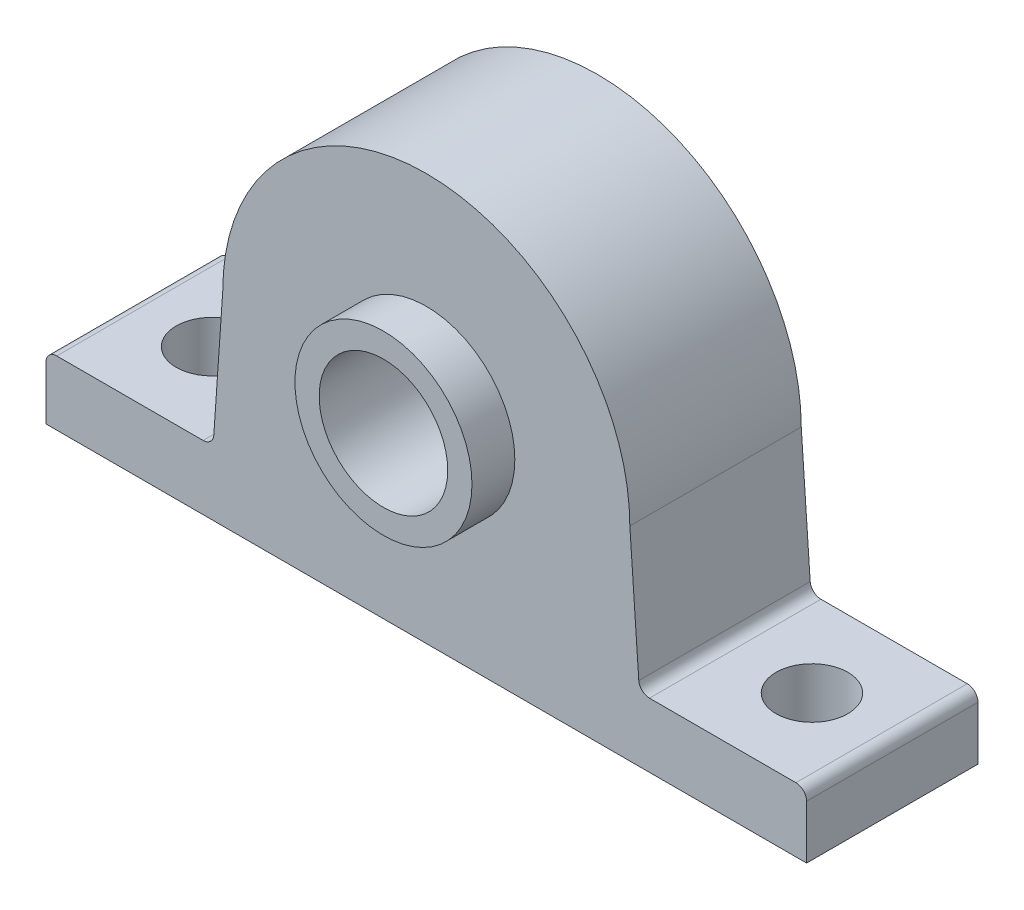
ISO-10303-21;
HEADER;
FILE_DESCRIPTION(('STEP AP214'),'2;1');
FILE_NAME('part.step','',(''),(''),'','','');
FILE_SCHEMA(('AUTOMOTIVE_DESIGN { 1 0 10303 214 1 1 1 1 }'));
ENDSEC;
DATA;
#1=APPLICATION_CONTEXT('core data for automotive mechanical design processes');
#2=APPLICATION_PROTOCOL_DEFINITION('international standard','automotive_design',2000,#1);
#3=PRODUCT_CONTEXT('',#1,'mechanical');
#4=PRODUCT('Part','Part','',(#3));
#5=PRODUCT_RELATED_PRODUCT_CATEGORY('part','',(#4));
#6=PRODUCT_DEFINITION_FORMATION('','',#4);
#7=PRODUCT_DEFINITION_CONTEXT('part definition',#1,'design');
#8=PRODUCT_DEFINITION('design','',#6,#7);
#9=PRODUCT_DEFINITION_SHAPE('','',#8);
#10=(LENGTH_UNIT() NAMED_UNIT(*) SI_UNIT(.MILLI.,.METRE.));
#11=(NAMED_UNIT(*) PLANE_ANGLE_UNIT() SI_UNIT($,.RADIAN.));
#12=(NAMED_UNIT(*) SI_UNIT($,.STERADIAN.) SOLID_ANGLE_UNIT());
#13=UNCERTAINTY_MEASURE_WITH_UNIT(LENGTH_MEASURE(1.E-05),#10,'distance_accuracy_value','');
#14=(GEOMETRIC_REPRESENTATION_CONTEXT(3) GLOBAL_UNCERTAINTY_ASSIGNED_CONTEXT((#13)) GLOBAL_UNIT_ASSIGNED_CONTEXT((#10,
#11,#12)) REPRESENTATION_CONTEXT('',''));
#15=CARTESIAN_POINT('',(0.,0.,0.));
#16=DIRECTION('',(0.,0.,1.));
#17=DIRECTION('',(1.,0.,0.));
#18=AXIS2_PLACEMENT_3D('',#15,#16,#17);
#19=CARTESIAN_POINT('',(0.,0.,16.));
#20=DIRECTION('',(0.,0.,1.));
#21=DIRECTION('',(1.,0.,0.));
#22=AXIS2_PLACEMENT_3D('',#19,#20,#21);
#23=PLANE('',#22);
#24=DIRECTION('',(1.,0.,0.));
#25=VECTOR('',#24,1.);
#26=CARTESIAN_POINT('',(0.,-13.,16.));
#27=LINE('',#26,#25);
#28=CARTESIAN_POINT('',(-34.5,-13.,16.));
#29=VERTEX_POINT('',#28);
#30=CARTESIAN_POINT('',(-20.8331628158486,-13.,16.));
#31=VERTEX_POINT('',#30);
#32=EDGE_CURVE('E204',#29,#31,#27,.T.);
#33=ORIENTED_EDGE('',*,*,#32,.F.);
#34=CARTESIAN_POINT('',(-34.5,-14.,16.));
#35=DIRECTION('',(0.,0.,1.));
#36=DIRECTION('',(1.,0.,0.));
#37=AXIS2_PLACEMENT_3D('',#34,#35,#36);
#38=CIRCLE('',#37,1.);
#39=CARTESIAN_POINT('',(-35.5,-14.,16.));
#40=VERTEX_POINT('',#39);
#41=EDGE_CURVE('E171',#29,#40,#38,.T.);
#42=ORIENTED_EDGE('',*,*,#41,.T.);
#43=DIRECTION('',(0.,1.,0.));
#44=VECTOR('',#43,1.);
#45=CARTESIAN_POINT('',(-35.5,0.,16.));
#46=LINE('',#45,#44);
#47=CARTESIAN_POINT('',(-35.5,-19.,16.));
#48=VERTEX_POINT('',#47);
#49=EDGE_CURVE('E143',#48,#40,#46,.T.);
#50=ORIENTED_EDGE('',*,*,#49,.F.);
#51=DIRECTION('',(1.,0.,0.));
#52=VECTOR('',#51,1.);
#53=CARTESIAN_POINT('',(0.,-19.,16.));
#54=LINE('',#53,#52);
#55=CARTESIAN_POINT('',(35.5,-19.,16.));
#56=VERTEX_POINT('',#55);
#57=EDGE_CURVE('E136',#48,#56,#54,.T.);
#58=ORIENTED_EDGE('',*,*,#57,.T.);
#59=DIRECTION('',(0.,1.,0.));
#60=VECTOR('',#59,1.);
#61=CARTESIAN_POINT('',(35.5,0.,16.));
#62=LINE('',#61,#60);
#63=CARTESIAN_POINT('',(35.5,-14.,16.));
#64=VERTEX_POINT('',#63);
#65=EDGE_CURVE('E125',#56,#64,#62,.T.);
#66=ORIENTED_EDGE('',*,*,#65,.T.);
#67=CARTESIAN_POINT('',(34.5,-14.,16.));
#68=DIRECTION('',(0.,0.,1.));
#69=DIRECTION('',(1.,0.,0.));
#70=AXIS2_PLACEMENT_3D('',#67,#68,#69);
#71=CIRCLE('',#70,1.);
#72=CARTESIAN_POINT('',(34.5,-13.,16.));
#73=VERTEX_POINT('',#72);
#74=EDGE_CURVE('E169',#64,#73,#71,.T.);
#75=ORIENTED_EDGE('',*,*,#74,.T.);
#76=DIRECTION('',(-1.,0.,0.));
#77=VECTOR('',#76,1.);
#78=CARTESIAN_POINT('',(0.,-13.,16.));
#79=LINE('',#78,#77);
#80=CARTESIAN_POINT('',(20.8331628158486,-13.,16.));
#81=VERTEX_POINT('',#80);
#82=EDGE_CURVE('E135',#73,#81,#79,.T.);
#83=ORIENTED_EDGE('',*,*,#82,.T.);
#84=CARTESIAN_POINT('',(20.8331628158486,-12.,16.));
#85=DIRECTION('',(0.,0.,1.));
#86=DIRECTION('',(1.,0.,0.));
#87=AXIS2_PLACEMENT_3D('',#84,#85,#86);
#88=CIRCLE('',#87,1.);
#89=CARTESIAN_POINT('',(19.8355506853592,-12.0690654551877,16.));
#90=VERTEX_POINT('',#89);
#91=EDGE_CURVE('E58',#81,#90,#88,.F.);
#92=ORIENTED_EDGE('',*,*,#91,.T.);
#93=DIRECTION('',(-0.0690654551877314,0.997612130489456,0.));
#94=VECTOR('',#93,1.);
#95=CARTESIAN_POINT('',(18.9093692950945,1.30911018196808,16.));
#96=LINE('',#95,#94);
#97=CARTESIAN_POINT('',(19.,0.,16.));
#98=VERTEX_POINT('',#97);
#99=EDGE_CURVE('E414',#90,#98,#96,.T.);
#100=ORIENTED_EDGE('',*,*,#99,.T.);
#101=CARTESIAN_POINT('',(0.,0.,16.));
#102=DIRECTION('',(0.,0.,1.));
#103=DIRECTION('',(1.,0.,0.));
#104=AXIS2_PLACEMENT_3D('',#101,#102,#103);
#105=CIRCLE('',#104,19.);
#106=CARTESIAN_POINT('',(-19.,0.,16.));
#107=VERTEX_POINT('',#106);
#108=EDGE_CURVE('E214',#98,#107,#105,.T.);
#109=ORIENTED_EDGE('',*,*,#108,.T.);
#110=DIRECTION('',(0.0690654551877314,0.997612130489456,0.));
#111=VECTOR('',#110,1.);
#112=CARTESIAN_POINT('',(-18.9093692950945,1.30911018196808,16.));
#113=LINE('',#112,#111);
#114=CARTESIAN_POINT('',(-19.8355506853592,-12.0690654551877,16.));
#115=VERTEX_POINT('',#114);
#116=EDGE_CURVE('E207',#115,#107,#113,.T.);
#117=ORIENTED_EDGE('',*,*,#116,.F.);
#118=CARTESIAN_POINT('',(-20.8331628158486,-12.,16.));
#119=DIRECTION('',(0.,0.,1.));
#120=DIRECTION('',(1.,0.,0.));
#121=AXIS2_PLACEMENT_3D('',#118,#119,#120);
#122=CIRCLE('',#121,1.);
#123=EDGE_CURVE('E11',#115,#31,#122,.F.);
#124=ORIENTED_EDGE('',*,*,#123,.T.);
#125=EDGE_LOOP('',(#33,#42,#50,#58,#66,#75,#83,#92,#100,#109,#117,#124));
#126=FACE_BOUND('',#125,.T.);
#127=CARTESIAN_POINT('',(0.,0.,16.));
#128=DIRECTION('',(0.,0.,1.));
#129=DIRECTION('',(1.,0.,0.));
#130=AXIS2_PLACEMENT_3D('',#127,#128,#129);
#131=CIRCLE('',#130,8.265);
#132=CARTESIAN_POINT('',(8.265,0.,16.));
#133=VERTEX_POINT('',#132);
#134=EDGE_CURVE('E420',#133,#133,#131,.T.);
#135=ORIENTED_EDGE('',*,*,#134,.F.);
#136=EDGE_LOOP('',(#135));
#137=FACE_BOUND('',#136,.T.);
#138=ADVANCED_FACE('F35',(#126,#137),#23,.T.);
#139=CARTESIAN_POINT('',(0.,-19.,16.));
#140=DIRECTION('',(0.,1.,0.));
#141=DIRECTION('',(0.,0.,1.));
#142=AXIS2_PLACEMENT_3D('',#139,#140,#141);
#143=PLANE('',#142);
#144=CARTESIAN_POINT('',(-28.,-19.,8.));
#145=DIRECTION('',(0.,-1.,0.));
#146=DIRECTION('',(0.,0.,1.));
#147=AXIS2_PLACEMENT_3D('',#144,#145,#146);
#148=CIRCLE('',#147,3.35);
#149=CARTESIAN_POINT('',(-28.,-19.,11.35));
#150=VERTEX_POINT('',#149);
#151=EDGE_CURVE('E434',#150,#150,#148,.T.);
#152=ORIENTED_EDGE('',*,*,#151,.F.);
#153=EDGE_LOOP('',(#152));
#154=FACE_BOUND('',#153,.T.);
#155=CARTESIAN_POINT('',(28.,-19.,8.));
#156=DIRECTION('',(0.,-1.,0.));
#157=DIRECTION('',(0.,0.,-1.));
#158=AXIS2_PLACEMENT_3D('',#155,#156,#157);
#159=CIRCLE('',#158,3.35);
#160=CARTESIAN_POINT('',(28.,-19.,4.65));
#161=VERTEX_POINT('',#160);
#162=EDGE_CURVE('E431',#161,#161,#159,.T.);
#163=ORIENTED_EDGE('',*,*,#162,.F.);
#164=EDGE_LOOP('',(#163));
#165=FACE_BOUND('',#164,.T.);
#166=DIRECTION('',(1.,0.,0.));
#167=VECTOR('',#166,1.);
#168=CARTESIAN_POINT('',(0.,-19.,0.));
#169=LINE('',#168,#167);
#170=CARTESIAN_POINT('',(-35.5,-19.,0.));
#171=VERTEX_POINT('',#170);
#172=CARTESIAN_POINT('',(35.5,-19.,0.));
#173=VERTEX_POINT('',#172);
#174=EDGE_CURVE('E149',#171,#173,#169,.T.);
#175=ORIENTED_EDGE('',*,*,#174,.T.);
#176=DIRECTION('',(0.,0.,-1.));
#177=VECTOR('',#176,1.);
#178=CARTESIAN_POINT('',(35.5,-19.,16.));
#179=LINE('',#178,#177);
#180=EDGE_CURVE('E130',#56,#173,#179,.T.);
#181=ORIENTED_EDGE('',*,*,#180,.F.);
#182=ORIENTED_EDGE('',*,*,#57,.F.);
#183=DIRECTION('',(0.,0.,-1.));
#184=VECTOR('',#183,1.);
#185=CARTESIAN_POINT('',(-35.5,-19.,16.));
#186=LINE('',#185,#184);
#187=EDGE_CURVE('E212',#48,#171,#186,.T.);
#188=ORIENTED_EDGE('',*,*,#187,.T.);
#189=EDGE_LOOP('',(#175,#181,#182,#188));
#190=FACE_BOUND('',#189,.T.);
#191=ADVANCED_FACE('F147',(#154,#165,#190),#143,.F.);
#192=CARTESIAN_POINT('',(35.5,0.,16.));
#193=DIRECTION('',(-1.,0.,0.));
#194=DIRECTION('',(0.,0.,1.));
#195=AXIS2_PLACEMENT_3D('',#192,#193,#194);
#196=PLANE('',#195);
#197=DIRECTION('',(0.,1.,0.));
#198=VECTOR('',#197,1.);
#199=CARTESIAN_POINT('',(35.5,0.,0.));
#200=LINE('',#199,#198);
#201=CARTESIAN_POINT('',(35.5,-14.,0.));
#202=VERTEX_POINT('',#201);
#203=EDGE_CURVE('E219',#173,#202,#200,.T.);
#204=ORIENTED_EDGE('',*,*,#203,.T.);
#205=DIRECTION('',(0.,0.,-1.));
#206=VECTOR('',#205,1.);
#207=CARTESIAN_POINT('',(35.5,-14.,16.));
#208=LINE('',#207,#206);
#209=EDGE_CURVE('E133',#202,#64,#208,.F.);
#210=ORIENTED_EDGE('',*,*,#209,.T.);
#211=ORIENTED_EDGE('',*,*,#65,.F.);
#212=ORIENTED_EDGE('',*,*,#180,.T.);
#213=EDGE_LOOP('',(#204,#210,#211,#212));
#214=FACE_BOUND('',#213,.T.);
#215=ADVANCED_FACE('F128',(#214),#196,.F.);
#216=CARTESIAN_POINT('',(0.,-13.,16.));
#217=DIRECTION('',(0.,-1.,0.));
#218=DIRECTION('',(0.,0.,-1.));
#219=AXIS2_PLACEMENT_3D('',#216,#217,#218);
#220=PLANE('',#219);
#221=CARTESIAN_POINT('',(28.,-13.,8.));
#222=DIRECTION('',(0.,-1.,0.));
#223=DIRECTION('',(0.,0.,-1.));
#224=AXIS2_PLACEMENT_3D('',#221,#222,#223);
#225=CIRCLE('',#224,3.35);
#226=CARTESIAN_POINT('',(28.,-13.,4.65));
#227=VERTEX_POINT('',#226);
#228=EDGE_CURVE('E428',#227,#227,#225,.F.);
#229=ORIENTED_EDGE('',*,*,#228,.F.);
#230=EDGE_LOOP('',(#229));
#231=FACE_BOUND('',#230,.T.);
#232=ORIENTED_EDGE('',*,*,#82,.F.);
#233=DIRECTION('',(0.,0.,-1.));
#234=VECTOR('',#233,1.);
#235=CARTESIAN_POINT('',(34.5,-13.,16.));
#236=LINE('',#235,#234);
#237=CARTESIAN_POINT('',(34.5,-13.,0.));
#238=VERTEX_POINT('',#237);
#239=EDGE_CURVE('E175',#73,#238,#236,.T.);
#240=ORIENTED_EDGE('',*,*,#239,.T.);
#241=DIRECTION('',(-1.,0.,0.));
#242=VECTOR('',#241,1.);
#243=CARTESIAN_POINT('',(0.,-13.,0.));
#244=LINE('',#243,#242);
#245=CARTESIAN_POINT('',(20.8331628158486,-13.,0.));
#246=VERTEX_POINT('',#245);
#247=EDGE_CURVE('E222',#238,#246,#244,.T.);
#248=ORIENTED_EDGE('',*,*,#247,.T.);
#249=DIRECTION('',(0.,0.,-1.));
#250=VECTOR('',#249,1.);
#251=CARTESIAN_POINT('',(20.8331628158486,-13.,16.));
#252=LINE('',#251,#250);
#253=EDGE_CURVE('E173',#246,#81,#252,.F.);
#254=ORIENTED_EDGE('',*,*,#253,.T.);
#255=EDGE_LOOP('',(#232,#240,#248,#254));
#256=FACE_BOUND('',#255,.T.);
#257=ADVANCED_FACE('F282',(#231,#256),#220,.F.);
#258=CARTESIAN_POINT('',(18.9093692950945,1.30911018196808,16.));
#259=DIRECTION('',(-0.997612130489456,-0.0690654551877314,0.));
#260=DIRECTION('',(0.0690654551877314,-0.997612130489456,0.));
#261=AXIS2_PLACEMENT_3D('',#258,#259,#260);
#262=PLANE('',#261);
#263=ORIENTED_EDGE('',*,*,#99,.F.);
#264=DIRECTION('',(0.,0.,-1.));
#265=VECTOR('',#264,1.);
#266=CARTESIAN_POINT('',(19.8355506853592,-12.0690654551877,0.));
#267=LINE('',#266,#265);
#268=CARTESIAN_POINT('',(19.8355506853592,-12.0690654551877,0.));
#269=VERTEX_POINT('',#268);
#270=EDGE_CURVE('E179',#90,#269,#267,.T.);
#271=ORIENTED_EDGE('',*,*,#270,.T.);
#272=DIRECTION('',(-0.0690654551877314,0.997612130489456,0.));
#273=VECTOR('',#272,1.);
#274=CARTESIAN_POINT('',(18.9093692950945,1.30911018196808,0.));
#275=LINE('',#274,#273);
#276=CARTESIAN_POINT('',(19.,0.,0.));
#277=VERTEX_POINT('',#276);
#278=EDGE_CURVE('E225',#269,#277,#275,.T.);
#279=ORIENTED_EDGE('',*,*,#278,.T.);
#280=DIRECTION('',(0.,0.,-1.));
#281=VECTOR('',#280,1.);
#282=CARTESIAN_POINT('',(19.,0.,16.));
#283=LINE('',#282,#281);
#284=EDGE_CURVE('E151',#98,#277,#283,.T.);
#285=ORIENTED_EDGE('',*,*,#284,.F.);
#286=EDGE_LOOP('',(#263,#271,#279,#285));
#287=FACE_BOUND('',#286,.T.);
#288=ADVANCED_FACE('F278',(#287),#262,.F.);
#289=CARTESIAN_POINT('',(0.,0.,16.));
#290=DIRECTION('',(0.,0.,-1.));
#291=DIRECTION('',(-1.,0.,0.));
#292=AXIS2_PLACEMENT_3D('',#289,#290,#291);
#293=CYLINDRICAL_SURFACE('',#292,19.);
#294=CARTESIAN_POINT('',(0.,0.,0.));
#295=DIRECTION('',(0.,0.,1.));
#296=DIRECTION('',(1.,0.,0.));
#297=AXIS2_PLACEMENT_3D('',#294,#295,#296);
#298=CIRCLE('',#297,19.);
#299=CARTESIAN_POINT('',(-19.,0.,0.));
#300=VERTEX_POINT('',#299);
#301=EDGE_CURVE('E200',#277,#300,#298,.T.);
#302=ORIENTED_EDGE('',*,*,#301,.T.);
#303=DIRECTION('',(0.,0.,-1.));
#304=VECTOR('',#303,1.);
#305=CARTESIAN_POINT('',(-19.,0.,16.));
#306=LINE('',#305,#304);
#307=EDGE_CURVE('E157',#107,#300,#306,.T.);
#308=ORIENTED_EDGE('',*,*,#307,.F.);
#309=ORIENTED_EDGE('',*,*,#108,.F.);
#310=ORIENTED_EDGE('',*,*,#284,.T.);
#311=EDGE_LOOP('',(#302,#308,#309,#310));
#312=FACE_BOUND('',#311,.T.);
#313=ADVANCED_FACE('F275',(#312),#293,.T.);
#314=CARTESIAN_POINT('',(-18.9093692950945,1.30911018196808,16.));
#315=DIRECTION('',(-0.997612130489456,0.0690654551877314,0.));
#316=DIRECTION('',(-0.0690654551877314,-0.997612130489456,0.));
#317=AXIS2_PLACEMENT_3D('',#314,#315,#316);
#318=PLANE('',#317);
#319=DIRECTION('',(0.0690654551877314,0.997612130489456,0.));
#320=VECTOR('',#319,1.);
#321=CARTESIAN_POINT('',(-18.9093692950945,1.30911018196808,0.));
#322=LINE('',#321,#320);
#323=CARTESIAN_POINT('',(-19.8355506853592,-12.0690654551877,0.));
#324=VERTEX_POINT('',#323);
#325=EDGE_CURVE('E191',#324,#300,#322,.T.);
#326=ORIENTED_EDGE('',*,*,#325,.F.);
#327=DIRECTION('',(0.,0.,-1.));
#328=VECTOR('',#327,1.);
#329=CARTESIAN_POINT('',(-19.8355506853592,-12.0690654551877,16.));
#330=LINE('',#329,#328);
#331=EDGE_CURVE('E50',#324,#115,#330,.F.);
#332=ORIENTED_EDGE('',*,*,#331,.T.);
#333=ORIENTED_EDGE('',*,*,#116,.T.);
#334=ORIENTED_EDGE('',*,*,#307,.T.);
#335=EDGE_LOOP('',(#326,#332,#333,#334));
#336=FACE_BOUND('',#335,.T.);
#337=ADVANCED_FACE('F197',(#336),#318,.T.);
#338=CARTESIAN_POINT('',(0.,-13.,16.));
#339=DIRECTION('',(0.,1.,0.));
#340=DIRECTION('',(0.,0.,1.));
#341=AXIS2_PLACEMENT_3D('',#338,#339,#340);
#342=PLANE('',#341);
#343=CARTESIAN_POINT('',(-28.,-13.,8.));
#344=DIRECTION('',(0.,1.,0.));
#345=DIRECTION('',(0.,0.,1.));
#346=AXIS2_PLACEMENT_3D('',#343,#344,#345);
#347=CIRCLE('',#346,3.35);
#348=CARTESIAN_POINT('',(-28.,-13.,11.35));
#349=VERTEX_POINT('',#348);
#350=EDGE_CURVE('E435',#349,#349,#347,.F.);
#351=ORIENTED_EDGE('',*,*,#350,.T.);
#352=EDGE_LOOP('',(#351));
#353=FACE_BOUND('',#352,.T.);
#354=DIRECTION('',(1.,0.,0.));
#355=VECTOR('',#354,1.);
#356=CARTESIAN_POINT('',(0.,-13.,0.));
#357=LINE('',#356,#355);
#358=CARTESIAN_POINT('',(-34.5,-13.,0.));
#359=VERTEX_POINT('',#358);
#360=CARTESIAN_POINT('',(-20.8331628158486,-13.,0.));
#361=VERTEX_POINT('',#360);
#362=EDGE_CURVE('E194',#359,#361,#357,.T.);
#363=ORIENTED_EDGE('',*,*,#362,.F.);
#364=DIRECTION('',(0.,0.,-1.));
#365=VECTOR('',#364,1.);
#366=CARTESIAN_POINT('',(-34.5,-13.,16.));
#367=LINE('',#366,#365);
#368=EDGE_CURVE('E167',#359,#29,#367,.F.);
#369=ORIENTED_EDGE('',*,*,#368,.T.);
#370=ORIENTED_EDGE('',*,*,#32,.T.);
#371=DIRECTION('',(0.,0.,-1.));
#372=VECTOR('',#371,1.);
#373=CARTESIAN_POINT('',(-20.8331628158486,-13.,0.));
#374=LINE('',#373,#372);
#375=EDGE_CURVE('E164',#31,#361,#374,.T.);
#376=ORIENTED_EDGE('',*,*,#375,.T.);
#377=EDGE_LOOP('',(#363,#369,#370,#376));
#378=FACE_BOUND('',#377,.T.);
#379=ADVANCED_FACE('F209',(#353,#378),#342,.T.);
#380=CARTESIAN_POINT('',(-35.5,0.,16.));
#381=DIRECTION('',(-1.,0.,0.));
#382=DIRECTION('',(0.,0.,1.));
#383=AXIS2_PLACEMENT_3D('',#380,#381,#382);
#384=PLANE('',#383);
#385=ORIENTED_EDGE('',*,*,#49,.T.);
#386=DIRECTION('',(0.,0.,-1.));
#387=VECTOR('',#386,1.);
#388=CARTESIAN_POINT('',(-35.5,-14.,16.));
#389=LINE('',#388,#387);
#390=CARTESIAN_POINT('',(-35.5,-14.,0.));
#391=VERTEX_POINT('',#390);
#392=EDGE_CURVE('E150',#40,#391,#389,.T.);
#393=ORIENTED_EDGE('',*,*,#392,.T.);
#394=DIRECTION('',(0.,1.,0.));
#395=VECTOR('',#394,1.);
#396=CARTESIAN_POINT('',(-35.5,0.,0.));
#397=LINE('',#396,#395);
#398=EDGE_CURVE('E229',#171,#391,#397,.T.);
#399=ORIENTED_EDGE('',*,*,#398,.F.);
#400=ORIENTED_EDGE('',*,*,#187,.F.);
#401=EDGE_LOOP('',(#385,#393,#399,#400));
#402=FACE_BOUND('',#401,.T.);
#403=ADVANCED_FACE('F235',(#402),#384,.T.);
#404=CARTESIAN_POINT('',(0.,0.,16.));
#405=DIRECTION('',(0.,0.,-1.));
#406=DIRECTION('',(-1.,0.,0.));
#407=AXIS2_PLACEMENT_3D('',#404,#405,#406);
#408=CYLINDRICAL_SURFACE('',#407,6.);
#409=CARTESIAN_POINT('',(0.,0.,0.));
#410=DIRECTION('',(0.,0.,1.));
#411=DIRECTION('',(1.,0.,0.));
#412=AXIS2_PLACEMENT_3D('',#409,#410,#411);
#413=CIRCLE('',#412,6.);
#414=CARTESIAN_POINT('',(6.,0.,0.));
#415=VERTEX_POINT('',#414);
#416=EDGE_CURVE('E145',#415,#415,#413,.T.);
#417=ORIENTED_EDGE('',*,*,#416,.F.);
#418=EDGE_LOOP('',(#417));
#419=FACE_BOUND('',#418,.T.);
#420=CARTESIAN_POINT('',(0.,0.,20.));
#421=DIRECTION('',(0.,0.,1.));
#422=DIRECTION('',(1.,0.,0.));
#423=AXIS2_PLACEMENT_3D('',#420,#421,#422);
#424=CIRCLE('',#423,6.);
#425=CARTESIAN_POINT('',(6.,0.,20.));
#426=VERTEX_POINT('',#425);
#427=EDGE_CURVE('E423',#426,#426,#424,.T.);
#428=ORIENTED_EDGE('',*,*,#427,.T.);
#429=EDGE_LOOP('',(#428));
#430=FACE_BOUND('',#429,.T.);
#431=ADVANCED_FACE('F264',(#419,#430),#408,.F.);
#432=CARTESIAN_POINT('',(0.,0.,0.));
#433=DIRECTION('',(0.,0.,1.));
#434=DIRECTION('',(1.,0.,0.));
#435=AXIS2_PLACEMENT_3D('',#432,#433,#434);
#436=PLANE('',#435);
#437=ORIENTED_EDGE('',*,*,#398,.T.);
#438=CARTESIAN_POINT('',(-34.5,-14.,0.));
#439=DIRECTION('',(0.,0.,1.));
#440=DIRECTION('',(1.,0.,0.));
#441=AXIS2_PLACEMENT_3D('',#438,#439,#440);
#442=CIRCLE('',#441,1.);
#443=EDGE_CURVE('E162',#391,#359,#442,.F.);
#444=ORIENTED_EDGE('',*,*,#443,.T.);
#445=ORIENTED_EDGE('',*,*,#362,.T.);
#446=CARTESIAN_POINT('',(-20.8331628158486,-12.,0.));
#447=DIRECTION('',(0.,0.,1.));
#448=DIRECTION('',(1.,0.,0.));
#449=AXIS2_PLACEMENT_3D('',#446,#447,#448);
#450=CIRCLE('',#449,1.);
#451=EDGE_CURVE('E43',#361,#324,#450,.T.);
#452=ORIENTED_EDGE('',*,*,#451,.T.);
#453=ORIENTED_EDGE('',*,*,#325,.T.);
#454=ORIENTED_EDGE('',*,*,#301,.F.);
#455=ORIENTED_EDGE('',*,*,#278,.F.);
#456=CARTESIAN_POINT('',(20.8331628158486,-12.,0.));
#457=DIRECTION('',(0.,0.,1.));
#458=DIRECTION('',(1.,0.,0.));
#459=AXIS2_PLACEMENT_3D('',#456,#457,#458);
#460=CIRCLE('',#459,1.);
#461=EDGE_CURVE('E183',#269,#246,#460,.T.);
#462=ORIENTED_EDGE('',*,*,#461,.T.);
#463=ORIENTED_EDGE('',*,*,#247,.F.);
#464=CARTESIAN_POINT('',(34.5,-14.,0.));
#465=DIRECTION('',(0.,0.,1.));
#466=DIRECTION('',(1.,0.,0.));
#467=AXIS2_PLACEMENT_3D('',#464,#465,#466);
#468=CIRCLE('',#467,1.);
#469=EDGE_CURVE('E154',#238,#202,#468,.F.);
#470=ORIENTED_EDGE('',*,*,#469,.T.);
#471=ORIENTED_EDGE('',*,*,#203,.F.);
#472=ORIENTED_EDGE('',*,*,#174,.F.);
#473=EDGE_LOOP('',(#437,#444,#445,#452,#453,#454,#455,#462,#463,#470,#471,#472));
#474=FACE_BOUND('',#473,.T.);
#475=ORIENTED_EDGE('',*,*,#416,.T.);
#476=EDGE_LOOP('',(#475));
#477=FACE_BOUND('',#476,.T.);
#478=ADVANCED_FACE('F188',(#474,#477),#436,.F.);
#479=CARTESIAN_POINT('',(0.,0.,20.));
#480=DIRECTION('',(0.,0.,1.));
#481=DIRECTION('',(1.,0.,0.));
#482=AXIS2_PLACEMENT_3D('',#479,#480,#481);
#483=PLANE('',#482);
#484=CARTESIAN_POINT('',(0.,0.,20.));
#485=DIRECTION('',(0.,0.,1.));
#486=DIRECTION('',(1.,0.,0.));
#487=AXIS2_PLACEMENT_3D('',#484,#485,#486);
#488=CIRCLE('',#487,8.265);
#489=CARTESIAN_POINT('',(8.265,0.,20.));
#490=VERTEX_POINT('',#489);
#491=EDGE_CURVE('E220',#490,#490,#488,.T.);
#492=ORIENTED_EDGE('',*,*,#491,.T.);
#493=EDGE_LOOP('',(#492));
#494=FACE_BOUND('',#493,.T.);
#495=ORIENTED_EDGE('',*,*,#427,.F.);
#496=EDGE_LOOP('',(#495));
#497=FACE_BOUND('',#496,.T.);
#498=ADVANCED_FACE('F250',(#494,#497),#483,.T.);
#499=CARTESIAN_POINT('',(0.,0.,20.));
#500=DIRECTION('',(0.,0.,-1.));
#501=DIRECTION('',(-1.,0.,0.));
#502=AXIS2_PLACEMENT_3D('',#499,#500,#501);
#503=CYLINDRICAL_SURFACE('',#502,8.265);
#504=ORIENTED_EDGE('',*,*,#491,.F.);
#505=EDGE_LOOP('',(#504));
#506=FACE_BOUND('',#505,.T.);
#507=ORIENTED_EDGE('',*,*,#134,.T.);
#508=EDGE_LOOP('',(#507));
#509=FACE_BOUND('',#508,.T.);
#510=ADVANCED_FACE('F241',(#506,#509),#503,.T.);
#511=CARTESIAN_POINT('',(-34.5,-14.,16.));
#512=DIRECTION('',(0.,0.,-1.));
#513=DIRECTION('',(-1.,0.,0.));
#514=AXIS2_PLACEMENT_3D('',#511,#512,#513);
#515=CYLINDRICAL_SURFACE('',#514,1.);
#516=ORIENTED_EDGE('',*,*,#41,.F.);
#517=ORIENTED_EDGE('',*,*,#368,.F.);
#518=ORIENTED_EDGE('',*,*,#443,.F.);
#519=ORIENTED_EDGE('',*,*,#392,.F.);
#520=EDGE_LOOP('',(#516,#517,#518,#519));
#521=FACE_BOUND('',#520,.T.);
#522=ADVANCED_FACE('F238',(#521),#515,.T.);
#523=CARTESIAN_POINT('',(34.5,-14.,16.));
#524=DIRECTION('',(0.,0.,-1.));
#525=DIRECTION('',(-1.,0.,0.));
#526=AXIS2_PLACEMENT_3D('',#523,#524,#525);
#527=CYLINDRICAL_SURFACE('',#526,1.);
#528=ORIENTED_EDGE('',*,*,#74,.F.);
#529=ORIENTED_EDGE('',*,*,#209,.F.);
#530=ORIENTED_EDGE('',*,*,#469,.F.);
#531=ORIENTED_EDGE('',*,*,#239,.F.);
#532=EDGE_LOOP('',(#528,#529,#530,#531));
#533=FACE_BOUND('',#532,.T.);
#534=ADVANCED_FACE('F240',(#533),#527,.T.);
#535=CARTESIAN_POINT('',(20.8331628158486,-12.,16.));
#536=DIRECTION('',(0.,0.,1.));
#537=DIRECTION('',(1.,0.,0.));
#538=AXIS2_PLACEMENT_3D('',#535,#536,#537);
#539=CYLINDRICAL_SURFACE('',#538,1.);
#540=ORIENTED_EDGE('',*,*,#91,.F.);
#541=ORIENTED_EDGE('',*,*,#253,.F.);
#542=ORIENTED_EDGE('',*,*,#461,.F.);
#543=ORIENTED_EDGE('',*,*,#270,.F.);
#544=EDGE_LOOP('',(#540,#541,#542,#543));
#545=FACE_BOUND('',#544,.T.);
#546=ADVANCED_FACE('F247',(#545),#539,.F.);
#547=CARTESIAN_POINT('',(-20.8331628158486,-12.,16.));
#548=DIRECTION('',(0.,0.,1.));
#549=DIRECTION('',(1.,0.,0.));
#550=AXIS2_PLACEMENT_3D('',#547,#548,#549);
#551=CYLINDRICAL_SURFACE('',#550,1.);
#552=ORIENTED_EDGE('',*,*,#123,.F.);
#553=ORIENTED_EDGE('',*,*,#331,.F.);
#554=ORIENTED_EDGE('',*,*,#451,.F.);
#555=ORIENTED_EDGE('',*,*,#375,.F.);
#556=EDGE_LOOP('',(#552,#553,#554,#555));
#557=FACE_BOUND('',#556,.T.);
#558=ADVANCED_FACE('F37',(#557),#551,.F.);
#559=CARTESIAN_POINT('',(28.,19.001,8.));
#560=DIRECTION('',(0.,-1.,0.));
#561=DIRECTION('',(0.,0.,-1.));
#562=AXIS2_PLACEMENT_3D('',#559,#560,#561);
#563=CYLINDRICAL_SURFACE('',#562,3.35);
#564=ORIENTED_EDGE('',*,*,#162,.T.);
#565=EDGE_LOOP('',(#564));
#566=FACE_BOUND('',#565,.T.);
#567=ORIENTED_EDGE('',*,*,#228,.T.);
#568=EDGE_LOOP('',(#567));
#569=FACE_BOUND('',#568,.T.);
#570=ADVANCED_FACE('F388',(#566,#569),#563,.F.);
#571=CARTESIAN_POINT('',(-28.,19.001,8.));
#572=DIRECTION('',(0.,-1.,0.));
#573=DIRECTION('',(0.,0.,-1.));
#574=AXIS2_PLACEMENT_3D('',#571,#572,#573);
#575=CYLINDRICAL_SURFACE('',#574,3.35);
#576=ORIENTED_EDGE('',*,*,#350,.F.);
#577=EDGE_LOOP('',(#576));
#578=FACE_BOUND('',#577,.T.);
#579=ORIENTED_EDGE('',*,*,#151,.T.);
#580=EDGE_LOOP('',(#579));
#581=FACE_BOUND('',#580,.T.);
#582=ADVANCED_FACE('F441',(#578,#581),#575,.F.);
#583=CLOSED_SHELL('',(#138,#191,#215,#257,#288,#313,#337,#379,#403,#431,#478,#498,#510,#522,
#534,#546,#558,#570,#582));
#584=MANIFOLD_SOLID_BREP('B2',#583);
#585=ADVANCED_BREP_SHAPE_REPRESENTATION('',(#18,#584),#14);
#586=SHAPE_DEFINITION_REPRESENTATION(#9,#585);
ENDSEC;
END-ISO-10303-21;
